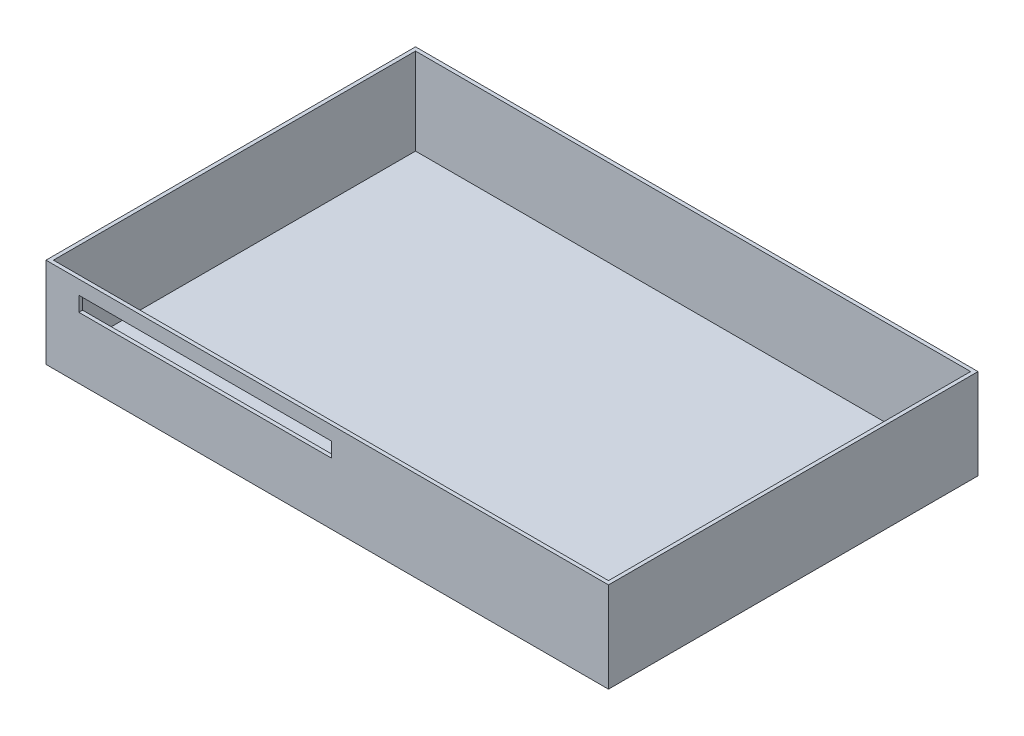
ISO-10303-21;
HEADER;
FILE_DESCRIPTION(('STEP AP214'),'2;1');
FILE_NAME('part.step','',(''),(''),'','','');
FILE_SCHEMA(('AUTOMOTIVE_DESIGN { 1 0 10303 214 1 1 1 1 }'));
ENDSEC;
DATA;
#1=APPLICATION_CONTEXT('core data for automotive mechanical design processes');
#2=APPLICATION_PROTOCOL_DEFINITION('international standard','automotive_design',2000,#1);
#3=PRODUCT_CONTEXT('',#1,'mechanical');
#4=PRODUCT('Part','Part','',(#3));
#5=PRODUCT_RELATED_PRODUCT_CATEGORY('part','',(#4));
#6=PRODUCT_DEFINITION_FORMATION('','',#4);
#7=PRODUCT_DEFINITION_CONTEXT('part definition',#1,'design');
#8=PRODUCT_DEFINITION('design','',#6,#7);
#9=PRODUCT_DEFINITION_SHAPE('','',#8);
#10=(LENGTH_UNIT() NAMED_UNIT(*) SI_UNIT(.MILLI.,.METRE.));
#11=(NAMED_UNIT(*) PLANE_ANGLE_UNIT() SI_UNIT($,.RADIAN.));
#12=(NAMED_UNIT(*) SI_UNIT($,.STERADIAN.) SOLID_ANGLE_UNIT());
#13=UNCERTAINTY_MEASURE_WITH_UNIT(LENGTH_MEASURE(1.E-05),#10,'distance_accuracy_value','');
#14=(GEOMETRIC_REPRESENTATION_CONTEXT(3) GLOBAL_UNCERTAINTY_ASSIGNED_CONTEXT((#13)) GLOBAL_UNIT_ASSIGNED_CONTEXT((#10,
#11,#12)) REPRESENTATION_CONTEXT('',''));
#15=CARTESIAN_POINT('',(0.,0.,0.));
#16=DIRECTION('',(0.,0.,1.));
#17=DIRECTION('',(1.,0.,0.));
#18=AXIS2_PLACEMENT_3D('',#15,#16,#17);
#19=CARTESIAN_POINT('',(0.,220.,0.));
#20=DIRECTION('',(0.,-1.,0.));
#21=DIRECTION('',(0.,0.,-1.));
#22=AXIS2_PLACEMENT_3D('',#19,#20,#21);
#23=PLANE('',#22);
#24=DIRECTION('',(0.,0.,1.));
#25=VECTOR('',#24,1.);
#26=CARTESIAN_POINT('',(0.,220.,0.));
#27=LINE('',#26,#25);
#28=CARTESIAN_POINT('',(0.,220.,-900.));
#29=VERTEX_POINT('',#28);
#30=CARTESIAN_POINT('',(0.,220.,0.));
#31=VERTEX_POINT('',#30);
#32=EDGE_CURVE('E193',#29,#31,#27,.T.);
#33=ORIENTED_EDGE('',*,*,#32,.T.);
#34=DIRECTION('',(1.,0.,0.));
#35=VECTOR('',#34,1.);
#36=CARTESIAN_POINT('',(0.,220.,0.));
#37=LINE('',#36,#35);
#38=CARTESIAN_POINT('',(1370.,220.,0.));
#39=VERTEX_POINT('',#38);
#40=EDGE_CURVE('E196',#31,#39,#37,.T.);
#41=ORIENTED_EDGE('',*,*,#40,.T.);
#42=DIRECTION('',(0.,0.,-1.));
#43=VECTOR('',#42,1.);
#44=CARTESIAN_POINT('',(1370.,220.,0.));
#45=LINE('',#44,#43);
#46=CARTESIAN_POINT('',(1370.,220.,-900.));
#47=VERTEX_POINT('',#46);
#48=EDGE_CURVE('E199',#39,#47,#45,.T.);
#49=ORIENTED_EDGE('',*,*,#48,.T.);
#50=DIRECTION('',(-1.,0.,0.));
#51=VECTOR('',#50,1.);
#52=CARTESIAN_POINT('',(0.,220.,-900.));
#53=LINE('',#52,#51);
#54=EDGE_CURVE('E201',#47,#29,#53,.T.);
#55=ORIENTED_EDGE('',*,*,#54,.T.);
#56=EDGE_LOOP('',(#33,#41,#49,#55));
#57=FACE_BOUND('',#56,.T.);
#58=DIRECTION('',(0.,0.,1.));
#59=VECTOR('',#58,1.);
#60=CARTESIAN_POINT('',(9.,220.,0.));
#61=LINE('',#60,#59);
#62=CARTESIAN_POINT('',(9.,220.,-891.));
#63=VERTEX_POINT('',#62);
#64=CARTESIAN_POINT('',(9.,220.,-9.));
#65=VERTEX_POINT('',#64);
#66=EDGE_CURVE('E185',#63,#65,#61,.T.);
#67=ORIENTED_EDGE('',*,*,#66,.F.);
#68=DIRECTION('',(-1.,0.,0.));
#69=VECTOR('',#68,1.);
#70=CARTESIAN_POINT('',(0.,220.,-891.));
#71=LINE('',#70,#69);
#72=CARTESIAN_POINT('',(1361.,220.,-891.));
#73=VERTEX_POINT('',#72);
#74=EDGE_CURVE('E175',#73,#63,#71,.T.);
#75=ORIENTED_EDGE('',*,*,#74,.F.);
#76=DIRECTION('',(0.,0.,-1.));
#77=VECTOR('',#76,1.);
#78=CARTESIAN_POINT('',(1361.,220.,0.));
#79=LINE('',#78,#77);
#80=CARTESIAN_POINT('',(1361.,220.,-9.));
#81=VERTEX_POINT('',#80);
#82=EDGE_CURVE('E189',#81,#73,#79,.T.);
#83=ORIENTED_EDGE('',*,*,#82,.F.);
#84=DIRECTION('',(1.,0.,0.));
#85=VECTOR('',#84,1.);
#86=CARTESIAN_POINT('',(0.,220.,-9.));
#87=LINE('',#86,#85);
#88=EDGE_CURVE('E187',#65,#81,#87,.T.);
#89=ORIENTED_EDGE('',*,*,#88,.F.);
#90=EDGE_LOOP('',(#67,#75,#83,#89));
#91=FACE_BOUND('',#90,.T.);
#92=ADVANCED_FACE('F37',(#57,#91),#23,.F.);
#93=CARTESIAN_POINT('',(0.,220.,0.));
#94=DIRECTION('',(1.,0.,0.));
#95=DIRECTION('',(0.,0.,-1.));
#96=AXIS2_PLACEMENT_3D('',#93,#94,#95);
#97=PLANE('',#96);
#98=DIRECTION('',(0.,0.,1.));
#99=VECTOR('',#98,1.);
#100=CARTESIAN_POINT('',(0.,0.,0.));
#101=LINE('',#100,#99);
#102=CARTESIAN_POINT('',(0.,0.,-900.));
#103=VERTEX_POINT('',#102);
#104=CARTESIAN_POINT('',(0.,0.,0.));
#105=VERTEX_POINT('',#104);
#106=EDGE_CURVE('E169',#103,#105,#101,.T.);
#107=ORIENTED_EDGE('',*,*,#106,.T.);
#108=DIRECTION('',(0.,-1.,0.));
#109=VECTOR('',#108,1.);
#110=CARTESIAN_POINT('',(0.,220.,0.));
#111=LINE('',#110,#109);
#112=EDGE_CURVE('E11',#31,#105,#111,.T.);
#113=ORIENTED_EDGE('',*,*,#112,.F.);
#114=ORIENTED_EDGE('',*,*,#32,.F.);
#115=DIRECTION('',(0.,-1.,0.));
#116=VECTOR('',#115,1.);
#117=CARTESIAN_POINT('',(0.,220.,-900.));
#118=LINE('',#117,#116);
#119=EDGE_CURVE('E203',#29,#103,#118,.T.);
#120=ORIENTED_EDGE('',*,*,#119,.T.);
#121=EDGE_LOOP('',(#107,#113,#114,#120));
#122=FACE_BOUND('',#121,.T.);
#123=ADVANCED_FACE('F39',(#122),#97,.F.);
#124=CARTESIAN_POINT('',(0.,220.,0.));
#125=DIRECTION('',(0.,0.,-1.));
#126=DIRECTION('',(-1.,0.,0.));
#127=AXIS2_PLACEMENT_3D('',#124,#125,#126);
#128=PLANE('',#127);
#129=DIRECTION('',(1.,0.,0.));
#130=VECTOR('',#129,1.);
#131=CARTESIAN_POINT('',(80.,150.,0.));
#132=LINE('',#131,#130);
#133=CARTESIAN_POINT('',(80.,150.,0.));
#134=VERTEX_POINT('',#133);
#135=CARTESIAN_POINT('',(695.,150.,0.));
#136=VERTEX_POINT('',#135);
#137=EDGE_CURVE('E149',#134,#136,#132,.T.);
#138=ORIENTED_EDGE('',*,*,#137,.F.);
#139=DIRECTION('',(0.,-1.,0.));
#140=VECTOR('',#139,1.);
#141=CARTESIAN_POINT('',(80.,186.,0.));
#142=LINE('',#141,#140);
#143=CARTESIAN_POINT('',(80.,186.,0.));
#144=VERTEX_POINT('',#143);
#145=EDGE_CURVE('E52',#144,#134,#142,.T.);
#146=ORIENTED_EDGE('',*,*,#145,.F.);
#147=DIRECTION('',(-1.,0.,0.));
#148=VECTOR('',#147,1.);
#149=CARTESIAN_POINT('',(80.,186.,0.));
#150=LINE('',#149,#148);
#151=CARTESIAN_POINT('',(695.,186.,0.));
#152=VERTEX_POINT('',#151);
#153=EDGE_CURVE('E136',#152,#144,#150,.T.);
#154=ORIENTED_EDGE('',*,*,#153,.F.);
#155=DIRECTION('',(0.,1.,0.));
#156=VECTOR('',#155,1.);
#157=CARTESIAN_POINT('',(695.,186.,0.));
#158=LINE('',#157,#156);
#159=EDGE_CURVE('E144',#136,#152,#158,.T.);
#160=ORIENTED_EDGE('',*,*,#159,.F.);
#161=EDGE_LOOP('',(#138,#146,#154,#160));
#162=FACE_BOUND('',#161,.T.);
#163=DIRECTION('',(1.,0.,0.));
#164=VECTOR('',#163,1.);
#165=CARTESIAN_POINT('',(0.,0.,0.));
#166=LINE('',#165,#164);
#167=CARTESIAN_POINT('',(1370.,0.,0.));
#168=VERTEX_POINT('',#167);
#169=EDGE_CURVE('E206',#105,#168,#166,.T.);
#170=ORIENTED_EDGE('',*,*,#169,.T.);
#171=DIRECTION('',(0.,-1.,0.));
#172=VECTOR('',#171,1.);
#173=CARTESIAN_POINT('',(1370.,220.,0.));
#174=LINE('',#173,#172);
#175=EDGE_CURVE('E45',#39,#168,#174,.T.);
#176=ORIENTED_EDGE('',*,*,#175,.F.);
#177=ORIENTED_EDGE('',*,*,#40,.F.);
#178=ORIENTED_EDGE('',*,*,#112,.T.);
#179=EDGE_LOOP('',(#170,#176,#177,#178));
#180=FACE_BOUND('',#179,.T.);
#181=ADVANCED_FACE('F147',(#162,#180),#128,.F.);
#182=CARTESIAN_POINT('',(1370.,220.,0.));
#183=DIRECTION('',(-1.,0.,0.));
#184=DIRECTION('',(0.,0.,1.));
#185=AXIS2_PLACEMENT_3D('',#182,#183,#184);
#186=PLANE('',#185);
#187=DIRECTION('',(0.,0.,-1.));
#188=VECTOR('',#187,1.);
#189=CARTESIAN_POINT('',(1370.,0.,0.));
#190=LINE('',#189,#188);
#191=CARTESIAN_POINT('',(1370.,0.,-900.));
#192=VERTEX_POINT('',#191);
#193=EDGE_CURVE('E208',#168,#192,#190,.T.);
#194=ORIENTED_EDGE('',*,*,#193,.T.);
#195=DIRECTION('',(0.,-1.,0.));
#196=VECTOR('',#195,1.);
#197=CARTESIAN_POINT('',(1370.,220.,-900.));
#198=LINE('',#197,#196);
#199=EDGE_CURVE('E213',#47,#192,#198,.T.);
#200=ORIENTED_EDGE('',*,*,#199,.F.);
#201=ORIENTED_EDGE('',*,*,#48,.F.);
#202=ORIENTED_EDGE('',*,*,#175,.T.);
#203=EDGE_LOOP('',(#194,#200,#201,#202));
#204=FACE_BOUND('',#203,.T.);
#205=ADVANCED_FACE('F220',(#204),#186,.F.);
#206=CARTESIAN_POINT('',(0.,220.,-900.));
#207=DIRECTION('',(0.,0.,1.));
#208=DIRECTION('',(1.,0.,0.));
#209=AXIS2_PLACEMENT_3D('',#206,#207,#208);
#210=PLANE('',#209);
#211=DIRECTION('',(-1.,0.,0.));
#212=VECTOR('',#211,1.);
#213=CARTESIAN_POINT('',(0.,0.,-900.));
#214=LINE('',#213,#212);
#215=EDGE_CURVE('E197',#192,#103,#214,.T.);
#216=ORIENTED_EDGE('',*,*,#215,.T.);
#217=ORIENTED_EDGE('',*,*,#119,.F.);
#218=ORIENTED_EDGE('',*,*,#54,.F.);
#219=ORIENTED_EDGE('',*,*,#199,.T.);
#220=EDGE_LOOP('',(#216,#217,#218,#219));
#221=FACE_BOUND('',#220,.T.);
#222=ADVANCED_FACE('F228',(#221),#210,.F.);
#223=CARTESIAN_POINT('',(0.,0.,0.));
#224=DIRECTION('',(0.,-1.,0.));
#225=DIRECTION('',(0.,0.,-1.));
#226=AXIS2_PLACEMENT_3D('',#223,#224,#225);
#227=PLANE('',#226);
#228=ORIENTED_EDGE('',*,*,#106,.F.);
#229=ORIENTED_EDGE('',*,*,#215,.F.);
#230=ORIENTED_EDGE('',*,*,#193,.F.);
#231=ORIENTED_EDGE('',*,*,#169,.F.);
#232=EDGE_LOOP('',(#228,#229,#230,#231));
#233=FACE_BOUND('',#232,.T.);
#234=ADVANCED_FACE('F225',(#233),#227,.T.);
#235=CARTESIAN_POINT('',(9.,220.,0.));
#236=DIRECTION('',(1.,0.,0.));
#237=DIRECTION('',(0.,0.,-1.));
#238=AXIS2_PLACEMENT_3D('',#235,#236,#237);
#239=PLANE('',#238);
#240=DIRECTION('',(0.,0.,1.));
#241=VECTOR('',#240,1.);
#242=CARTESIAN_POINT('',(9.,9.,0.));
#243=LINE('',#242,#241);
#244=CARTESIAN_POINT('',(9.,9.,-891.));
#245=VERTEX_POINT('',#244);
#246=CARTESIAN_POINT('',(9.,9.,-9.));
#247=VERTEX_POINT('',#246);
#248=EDGE_CURVE('E143',#245,#247,#243,.T.);
#249=ORIENTED_EDGE('',*,*,#248,.F.);
#250=DIRECTION('',(0.,-1.,0.));
#251=VECTOR('',#250,1.);
#252=CARTESIAN_POINT('',(9.,220.,-891.));
#253=LINE('',#252,#251);
#254=EDGE_CURVE('E171',#63,#245,#253,.T.);
#255=ORIENTED_EDGE('',*,*,#254,.F.);
#256=ORIENTED_EDGE('',*,*,#66,.T.);
#257=DIRECTION('',(0.,-1.,0.));
#258=VECTOR('',#257,1.);
#259=CARTESIAN_POINT('',(9.,220.,-9.));
#260=LINE('',#259,#258);
#261=EDGE_CURVE('E166',#65,#247,#260,.T.);
#262=ORIENTED_EDGE('',*,*,#261,.T.);
#263=EDGE_LOOP('',(#249,#255,#256,#262));
#264=FACE_BOUND('',#263,.T.);
#265=ADVANCED_FACE('F251',(#264),#239,.T.);
#266=CARTESIAN_POINT('',(0.,220.,-9.));
#267=DIRECTION('',(0.,0.,-1.));
#268=DIRECTION('',(-1.,0.,0.));
#269=AXIS2_PLACEMENT_3D('',#266,#267,#268);
#270=PLANE('',#269);
#271=DIRECTION('',(0.,-1.,0.));
#272=VECTOR('',#271,1.);
#273=CARTESIAN_POINT('',(80.,186.,-9.00000000000001));
#274=LINE('',#273,#272);
#275=CARTESIAN_POINT('',(80.,186.,-9.00000000000001));
#276=VERTEX_POINT('',#275);
#277=CARTESIAN_POINT('',(80.,150.,-9.00000000000001));
#278=VERTEX_POINT('',#277);
#279=EDGE_CURVE('E129',#276,#278,#274,.T.);
#280=ORIENTED_EDGE('',*,*,#279,.T.);
#281=DIRECTION('',(1.,0.,0.));
#282=VECTOR('',#281,1.);
#283=CARTESIAN_POINT('',(80.,150.,-9.00000000000001));
#284=LINE('',#283,#282);
#285=CARTESIAN_POINT('',(695.,150.,-9.));
#286=VERTEX_POINT('',#285);
#287=EDGE_CURVE('E152',#278,#286,#284,.T.);
#288=ORIENTED_EDGE('',*,*,#287,.T.);
#289=DIRECTION('',(0.,1.,0.));
#290=VECTOR('',#289,1.);
#291=CARTESIAN_POINT('',(695.,186.,-9.00000000000001));
#292=LINE('',#291,#290);
#293=CARTESIAN_POINT('',(695.,186.,-9.00000000000001));
#294=VERTEX_POINT('',#293);
#295=EDGE_CURVE('E132',#286,#294,#292,.T.);
#296=ORIENTED_EDGE('',*,*,#295,.T.);
#297=DIRECTION('',(-1.,0.,0.));
#298=VECTOR('',#297,1.);
#299=CARTESIAN_POINT('',(80.,186.,-9.00000000000001));
#300=LINE('',#299,#298);
#301=EDGE_CURVE('E133',#294,#276,#300,.T.);
#302=ORIENTED_EDGE('',*,*,#301,.T.);
#303=EDGE_LOOP('',(#280,#288,#296,#302));
#304=FACE_BOUND('',#303,.T.);
#305=DIRECTION('',(1.,0.,0.));
#306=VECTOR('',#305,1.);
#307=CARTESIAN_POINT('',(0.,9.,-9.));
#308=LINE('',#307,#306);
#309=CARTESIAN_POINT('',(1361.,9.,-9.));
#310=VERTEX_POINT('',#309);
#311=EDGE_CURVE('E165',#247,#310,#308,.T.);
#312=ORIENTED_EDGE('',*,*,#311,.F.);
#313=ORIENTED_EDGE('',*,*,#261,.F.);
#314=ORIENTED_EDGE('',*,*,#88,.T.);
#315=DIRECTION('',(0.,-1.,0.));
#316=VECTOR('',#315,1.);
#317=CARTESIAN_POINT('',(1361.,220.,-9.));
#318=LINE('',#317,#316);
#319=EDGE_CURVE('E170',#81,#310,#318,.T.);
#320=ORIENTED_EDGE('',*,*,#319,.T.);
#321=EDGE_LOOP('',(#312,#313,#314,#320));
#322=FACE_BOUND('',#321,.T.);
#323=ADVANCED_FACE('F267',(#304,#322),#270,.T.);
#324=CARTESIAN_POINT('',(1361.,220.,0.));
#325=DIRECTION('',(-1.,0.,0.));
#326=DIRECTION('',(0.,0.,1.));
#327=AXIS2_PLACEMENT_3D('',#324,#325,#326);
#328=PLANE('',#327);
#329=DIRECTION('',(0.,0.,-1.));
#330=VECTOR('',#329,1.);
#331=CARTESIAN_POINT('',(1361.,9.,0.));
#332=LINE('',#331,#330);
#333=CARTESIAN_POINT('',(1361.,9.,-891.));
#334=VERTEX_POINT('',#333);
#335=EDGE_CURVE('E177',#310,#334,#332,.T.);
#336=ORIENTED_EDGE('',*,*,#335,.F.);
#337=ORIENTED_EDGE('',*,*,#319,.F.);
#338=ORIENTED_EDGE('',*,*,#82,.T.);
#339=DIRECTION('',(0.,-1.,0.));
#340=VECTOR('',#339,1.);
#341=CARTESIAN_POINT('',(1361.,220.,-891.));
#342=LINE('',#341,#340);
#343=EDGE_CURVE('E174',#73,#334,#342,.T.);
#344=ORIENTED_EDGE('',*,*,#343,.T.);
#345=EDGE_LOOP('',(#336,#337,#338,#344));
#346=FACE_BOUND('',#345,.T.);
#347=ADVANCED_FACE('F276',(#346),#328,.T.);
#348=CARTESIAN_POINT('',(0.,220.,-891.));
#349=DIRECTION('',(0.,0.,1.));
#350=DIRECTION('',(1.,0.,0.));
#351=AXIS2_PLACEMENT_3D('',#348,#349,#350);
#352=PLANE('',#351);
#353=DIRECTION('',(-1.,0.,0.));
#354=VECTOR('',#353,1.);
#355=CARTESIAN_POINT('',(0.,9.,-891.));
#356=LINE('',#355,#354);
#357=EDGE_CURVE('E181',#334,#245,#356,.T.);
#358=ORIENTED_EDGE('',*,*,#357,.F.);
#359=ORIENTED_EDGE('',*,*,#343,.F.);
#360=ORIENTED_EDGE('',*,*,#74,.T.);
#361=ORIENTED_EDGE('',*,*,#254,.T.);
#362=EDGE_LOOP('',(#358,#359,#360,#361));
#363=FACE_BOUND('',#362,.T.);
#364=ADVANCED_FACE('F284',(#363),#352,.T.);
#365=CARTESIAN_POINT('',(0.,9.,0.));
#366=DIRECTION('',(0.,-1.,0.));
#367=DIRECTION('',(0.,0.,-1.));
#368=AXIS2_PLACEMENT_3D('',#365,#366,#367);
#369=PLANE('',#368);
#370=ORIENTED_EDGE('',*,*,#248,.T.);
#371=ORIENTED_EDGE('',*,*,#311,.T.);
#372=ORIENTED_EDGE('',*,*,#335,.T.);
#373=ORIENTED_EDGE('',*,*,#357,.T.);
#374=EDGE_LOOP('',(#370,#371,#372,#373));
#375=FACE_BOUND('',#374,.T.);
#376=ADVANCED_FACE('F247',(#375),#369,.F.);
#377=CARTESIAN_POINT('',(80.,186.,-900.001));
#378=DIRECTION('',(-1.,0.,0.));
#379=DIRECTION('',(0.,-1.,0.));
#380=AXIS2_PLACEMENT_3D('',#377,#378,#379);
#381=PLANE('',#380);
#382=DIRECTION('',(0.,0.,1.));
#383=VECTOR('',#382,1.);
#384=CARTESIAN_POINT('',(80.,186.,-900.001));
#385=LINE('',#384,#383);
#386=EDGE_CURVE('E125',#276,#144,#385,.T.);
#387=ORIENTED_EDGE('',*,*,#386,.T.);
#388=ORIENTED_EDGE('',*,*,#145,.T.);
#389=DIRECTION('',(0.,0.,1.));
#390=VECTOR('',#389,1.);
#391=CARTESIAN_POINT('',(80.,150.,-900.001));
#392=LINE('',#391,#390);
#393=EDGE_CURVE('E157',#278,#134,#392,.T.);
#394=ORIENTED_EDGE('',*,*,#393,.F.);
#395=ORIENTED_EDGE('',*,*,#279,.F.);
#396=EDGE_LOOP('',(#387,#388,#394,#395));
#397=FACE_BOUND('',#396,.T.);
#398=ADVANCED_FACE('F127',(#397),#381,.F.);
#399=CARTESIAN_POINT('',(80.,186.,-900.001));
#400=DIRECTION('',(0.,1.,0.));
#401=DIRECTION('',(-1.,0.,0.));
#402=AXIS2_PLACEMENT_3D('',#399,#400,#401);
#403=PLANE('',#402);
#404=DIRECTION('',(0.,0.,1.));
#405=VECTOR('',#404,1.);
#406=CARTESIAN_POINT('',(695.,186.,-900.001));
#407=LINE('',#406,#405);
#408=EDGE_CURVE('E139',#294,#152,#407,.T.);
#409=ORIENTED_EDGE('',*,*,#408,.T.);
#410=ORIENTED_EDGE('',*,*,#153,.T.);
#411=ORIENTED_EDGE('',*,*,#386,.F.);
#412=ORIENTED_EDGE('',*,*,#301,.F.);
#413=EDGE_LOOP('',(#409,#410,#411,#412));
#414=FACE_BOUND('',#413,.T.);
#415=ADVANCED_FACE('F137',(#414),#403,.F.);
#416=CARTESIAN_POINT('',(695.,186.,-900.001));
#417=DIRECTION('',(1.,0.,0.));
#418=DIRECTION('',(0.,1.,0.));
#419=AXIS2_PLACEMENT_3D('',#416,#417,#418);
#420=PLANE('',#419);
#421=DIRECTION('',(0.,0.,1.));
#422=VECTOR('',#421,1.);
#423=CARTESIAN_POINT('',(695.,150.,-900.001));
#424=LINE('',#423,#422);
#425=EDGE_CURVE('E60',#286,#136,#424,.T.);
#426=ORIENTED_EDGE('',*,*,#425,.T.);
#427=ORIENTED_EDGE('',*,*,#159,.T.);
#428=ORIENTED_EDGE('',*,*,#408,.F.);
#429=ORIENTED_EDGE('',*,*,#295,.F.);
#430=EDGE_LOOP('',(#426,#427,#428,#429));
#431=FACE_BOUND('',#430,.T.);
#432=ADVANCED_FACE('F309',(#431),#420,.F.);
#433=CARTESIAN_POINT('',(80.,150.,-900.001));
#434=DIRECTION('',(0.,-1.,0.));
#435=DIRECTION('',(0.,0.,-1.));
#436=AXIS2_PLACEMENT_3D('',#433,#434,#435);
#437=PLANE('',#436);
#438=ORIENTED_EDGE('',*,*,#393,.T.);
#439=ORIENTED_EDGE('',*,*,#137,.T.);
#440=ORIENTED_EDGE('',*,*,#425,.F.);
#441=ORIENTED_EDGE('',*,*,#287,.F.);
#442=EDGE_LOOP('',(#438,#439,#440,#441));
#443=FACE_BOUND('',#442,.T.);
#444=ADVANCED_FACE('F316',(#443),#437,.F.);
#445=CLOSED_SHELL('',(#92,#123,#181,#205,#222,#234,#265,#323,#347,#364,#376,#398,#415,#432,#444));
#446=MANIFOLD_SOLID_BREP('B2',#445);
#447=ADVANCED_BREP_SHAPE_REPRESENTATION('',(#18,#446),#14);
#448=SHAPE_DEFINITION_REPRESENTATION(#9,#447);
ENDSEC;
END-ISO-10303-21;
